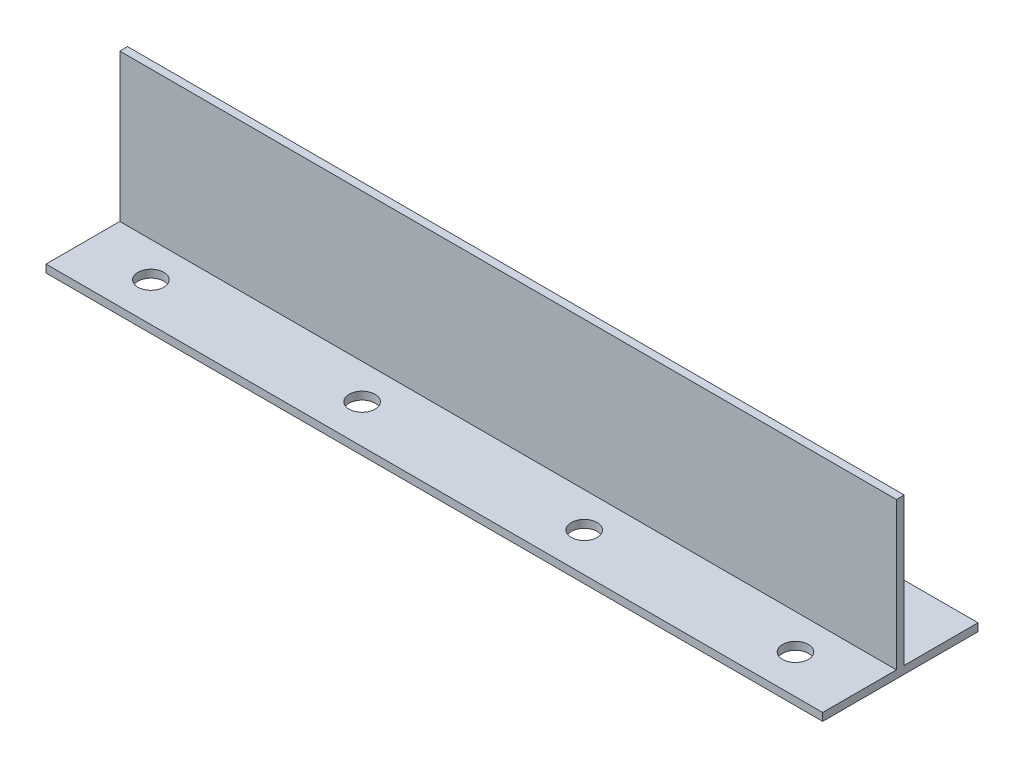
ISO-10303-21;
HEADER;
FILE_DESCRIPTION(('STEP AP214'),'2;1');
FILE_NAME('part.step','',(''),(''),'','','');
FILE_SCHEMA(('AUTOMOTIVE_DESIGN { 1 0 10303 214 1 1 1 1 }'));
ENDSEC;
DATA;
#1=APPLICATION_CONTEXT('core data for automotive mechanical design processes');
#2=APPLICATION_PROTOCOL_DEFINITION('international standard','automotive_design',2000,#1);
#3=PRODUCT_CONTEXT('',#1,'mechanical');
#4=PRODUCT('Part','Part','',(#3));
#5=PRODUCT_RELATED_PRODUCT_CATEGORY('part','',(#4));
#6=PRODUCT_DEFINITION_FORMATION('','',#4);
#7=PRODUCT_DEFINITION_CONTEXT('part definition',#1,'design');
#8=PRODUCT_DEFINITION('design','',#6,#7);
#9=PRODUCT_DEFINITION_SHAPE('','',#8);
#10=(LENGTH_UNIT() NAMED_UNIT(*) SI_UNIT(.MILLI.,.METRE.));
#11=(NAMED_UNIT(*) PLANE_ANGLE_UNIT() SI_UNIT($,.RADIAN.));
#12=(NAMED_UNIT(*) SI_UNIT($,.STERADIAN.) SOLID_ANGLE_UNIT());
#13=UNCERTAINTY_MEASURE_WITH_UNIT(LENGTH_MEASURE(1.E-05),#10,'distance_accuracy_value','');
#14=(GEOMETRIC_REPRESENTATION_CONTEXT(3) GLOBAL_UNCERTAINTY_ASSIGNED_CONTEXT((#13)) GLOBAL_UNIT_ASSIGNED_CONTEXT((#10,
#11,#12)) REPRESENTATION_CONTEXT('',''));
#15=CARTESIAN_POINT('',(0.,0.,0.));
#16=DIRECTION('',(0.,0.,1.));
#17=DIRECTION('',(1.,0.,0.));
#18=AXIS2_PLACEMENT_3D('',#15,#16,#17);
#19=CARTESIAN_POINT('',(150.,1.5,14.25));
#20=DIRECTION('',(0.,0.,-1.));
#21=DIRECTION('',(-1.,0.,0.));
#22=AXIS2_PLACEMENT_3D('',#19,#20,#21);
#23=PLANE('',#22);
#24=DIRECTION('',(0.,-1.,0.));
#25=VECTOR('',#24,1.);
#26=CARTESIAN_POINT('',(0.,1.5,14.25));
#27=LINE('',#26,#25);
#28=CARTESIAN_POINT('',(0.,1.5,14.25));
#29=VERTEX_POINT('',#28);
#30=CARTESIAN_POINT('',(0.,0.,14.25));
#31=VERTEX_POINT('',#30);
#32=EDGE_CURVE('E133',#29,#31,#27,.T.);
#33=ORIENTED_EDGE('',*,*,#32,.T.);
#34=DIRECTION('',(-1.,0.,0.));
#35=VECTOR('',#34,1.);
#36=CARTESIAN_POINT('',(150.,0.,14.25));
#37=LINE('',#36,#35);
#38=CARTESIAN_POINT('',(150.,0.,14.25));
#39=VERTEX_POINT('',#38);
#40=EDGE_CURVE('E11',#39,#31,#37,.T.);
#41=ORIENTED_EDGE('',*,*,#40,.F.);
#42=DIRECTION('',(0.,-1.,0.));
#43=VECTOR('',#42,1.);
#44=CARTESIAN_POINT('',(150.,1.5,14.25));
#45=LINE('',#44,#43);
#46=CARTESIAN_POINT('',(150.,1.5,14.25));
#47=VERTEX_POINT('',#46);
#48=EDGE_CURVE('E148',#47,#39,#45,.T.);
#49=ORIENTED_EDGE('',*,*,#48,.F.);
#50=DIRECTION('',(-1.,0.,0.));
#51=VECTOR('',#50,1.);
#52=CARTESIAN_POINT('',(150.,1.5,14.25));
#53=LINE('',#52,#51);
#54=EDGE_CURVE('E129',#47,#29,#53,.T.);
#55=ORIENTED_EDGE('',*,*,#54,.T.);
#56=EDGE_LOOP('',(#33,#41,#49,#55));
#57=FACE_BOUND('',#56,.T.);
#58=ADVANCED_FACE('F37',(#57),#23,.F.);
#59=CARTESIAN_POINT('',(150.,0.,14.25));
#60=DIRECTION('',(0.,1.,0.));
#61=DIRECTION('',(0.,0.,1.));
#62=AXIS2_PLACEMENT_3D('',#59,#60,#61);
#63=PLANE('',#62);
#64=CARTESIAN_POINT('',(12.75,0.,-8.25));
#65=DIRECTION('',(0.,1.,0.));
#66=DIRECTION('',(0.,0.,1.));
#67=AXIS2_PLACEMENT_3D('',#64,#65,#66);
#68=CIRCLE('',#67,2.5);
#69=CARTESIAN_POINT('',(12.75,0.,-5.75));
#70=VERTEX_POINT('',#69);
#71=EDGE_CURVE('E184',#70,#70,#68,.T.);
#72=ORIENTED_EDGE('',*,*,#71,.T.);
#73=EDGE_LOOP('',(#72));
#74=FACE_BOUND('',#73,.T.);
#75=CARTESIAN_POINT('',(53.55,0.,-8.25));
#76=DIRECTION('',(0.,1.,0.));
#77=DIRECTION('',(0.,0.,1.));
#78=AXIS2_PLACEMENT_3D('',#75,#76,#77);
#79=CIRCLE('',#78,2.49999999999999);
#80=CARTESIAN_POINT('',(53.55,0.,-5.75000000000001));
#81=VERTEX_POINT('',#80);
#82=EDGE_CURVE('E203',#81,#81,#79,.T.);
#83=ORIENTED_EDGE('',*,*,#82,.T.);
#84=EDGE_LOOP('',(#83));
#85=FACE_BOUND('',#84,.T.);
#86=CARTESIAN_POINT('',(53.55,0.,6.75));
#87=DIRECTION('',(0.,1.,0.));
#88=DIRECTION('',(0.,0.,1.));
#89=AXIS2_PLACEMENT_3D('',#86,#87,#88);
#90=CIRCLE('',#89,2.49999999999999);
#91=CARTESIAN_POINT('',(53.55,0.,9.25));
#92=VERTEX_POINT('',#91);
#93=EDGE_CURVE('E197',#92,#92,#90,.T.);
#94=ORIENTED_EDGE('',*,*,#93,.T.);
#95=EDGE_LOOP('',(#94));
#96=FACE_BOUND('',#95,.T.);
#97=CARTESIAN_POINT('',(96.45,0.,6.75));
#98=DIRECTION('',(0.,1.,0.));
#99=DIRECTION('',(0.,0.,-1.));
#100=AXIS2_PLACEMENT_3D('',#97,#98,#99);
#101=CIRCLE('',#100,2.50000000000001);
#102=CARTESIAN_POINT('',(96.45,0.,4.24999999999999));
#103=VERTEX_POINT('',#102);
#104=EDGE_CURVE('E190',#103,#103,#101,.T.);
#105=ORIENTED_EDGE('',*,*,#104,.T.);
#106=EDGE_LOOP('',(#105));
#107=FACE_BOUND('',#106,.T.);
#108=CARTESIAN_POINT('',(96.45,0.,-8.25000000000001));
#109=DIRECTION('',(0.,1.,0.));
#110=DIRECTION('',(0.,0.,-1.));
#111=AXIS2_PLACEMENT_3D('',#108,#109,#110);
#112=CIRCLE('',#111,2.50000000000001);
#113=CARTESIAN_POINT('',(96.45,0.,-10.75));
#114=VERTEX_POINT('',#113);
#115=EDGE_CURVE('E191',#114,#114,#112,.T.);
#116=ORIENTED_EDGE('',*,*,#115,.T.);
#117=EDGE_LOOP('',(#116));
#118=FACE_BOUND('',#117,.T.);
#119=CARTESIAN_POINT('',(137.25,0.,-8.24999999999998));
#120=DIRECTION('',(0.,1.,0.));
#121=DIRECTION('',(0.,0.,-1.));
#122=AXIS2_PLACEMENT_3D('',#119,#120,#121);
#123=CIRCLE('',#122,2.50000000000002);
#124=CARTESIAN_POINT('',(137.25,0.,-10.75));
#125=VERTEX_POINT('',#124);
#126=EDGE_CURVE('E220',#125,#125,#123,.T.);
#127=ORIENTED_EDGE('',*,*,#126,.T.);
#128=EDGE_LOOP('',(#127));
#129=FACE_BOUND('',#128,.T.);
#130=CARTESIAN_POINT('',(137.25,0.,6.74999999999998));
#131=DIRECTION('',(0.,1.,0.));
#132=DIRECTION('',(0.,0.,-1.));
#133=AXIS2_PLACEMENT_3D('',#130,#131,#132);
#134=CIRCLE('',#133,2.50000000000002);
#135=CARTESIAN_POINT('',(137.25,0.,4.24999999999996));
#136=VERTEX_POINT('',#135);
#137=EDGE_CURVE('E214',#136,#136,#134,.T.);
#138=ORIENTED_EDGE('',*,*,#137,.T.);
#139=EDGE_LOOP('',(#138));
#140=FACE_BOUND('',#139,.T.);
#141=CARTESIAN_POINT('',(12.75,0.,6.75));
#142=DIRECTION('',(0.,1.,0.));
#143=DIRECTION('',(0.,0.,1.));
#144=AXIS2_PLACEMENT_3D('',#141,#142,#143);
#145=CIRCLE('',#144,2.5);
#146=CARTESIAN_POINT('',(12.75,0.,9.25));
#147=VERTEX_POINT('',#146);
#148=EDGE_CURVE('E137',#147,#147,#145,.T.);
#149=ORIENTED_EDGE('',*,*,#148,.T.);
#150=EDGE_LOOP('',(#149));
#151=FACE_BOUND('',#150,.T.);
#152=DIRECTION('',(0.,0.,-1.));
#153=VECTOR('',#152,1.);
#154=CARTESIAN_POINT('',(0.,0.,14.25));
#155=LINE('',#154,#153);
#156=CARTESIAN_POINT('',(0.,0.,-15.75));
#157=VERTEX_POINT('',#156);
#158=EDGE_CURVE('E136',#31,#157,#155,.T.);
#159=ORIENTED_EDGE('',*,*,#158,.T.);
#160=DIRECTION('',(-1.,0.,0.));
#161=VECTOR('',#160,1.);
#162=CARTESIAN_POINT('',(150.,0.,-15.75));
#163=LINE('',#162,#161);
#164=CARTESIAN_POINT('',(150.,0.,-15.75));
#165=VERTEX_POINT('',#164);
#166=EDGE_CURVE('E45',#165,#157,#163,.T.);
#167=ORIENTED_EDGE('',*,*,#166,.F.);
#168=DIRECTION('',(0.,0.,-1.));
#169=VECTOR('',#168,1.);
#170=CARTESIAN_POINT('',(150.,0.,14.25));
#171=LINE('',#170,#169);
#172=EDGE_CURVE('E96',#39,#165,#171,.T.);
#173=ORIENTED_EDGE('',*,*,#172,.F.);
#174=ORIENTED_EDGE('',*,*,#40,.T.);
#175=EDGE_LOOP('',(#159,#167,#173,#174));
#176=FACE_BOUND('',#175,.T.);
#177=ADVANCED_FACE('F229',(#74,#85,#96,#107,#118,#129,#140,#151,#176),#63,.F.);
#178=CARTESIAN_POINT('',(150.,0.,-15.75));
#179=DIRECTION('',(0.,0.,1.));
#180=DIRECTION('',(1.,0.,0.));
#181=AXIS2_PLACEMENT_3D('',#178,#179,#180);
#182=PLANE('',#181);
#183=DIRECTION('',(0.,1.,0.));
#184=VECTOR('',#183,1.);
#185=CARTESIAN_POINT('',(0.,0.,-15.75));
#186=LINE('',#185,#184);
#187=CARTESIAN_POINT('',(0.,1.5,-15.75));
#188=VERTEX_POINT('',#187);
#189=EDGE_CURVE('E139',#157,#188,#186,.T.);
#190=ORIENTED_EDGE('',*,*,#189,.T.);
#191=DIRECTION('',(-1.,0.,0.));
#192=VECTOR('',#191,1.);
#193=CARTESIAN_POINT('',(150.,1.5,-15.75));
#194=LINE('',#193,#192);
#195=CARTESIAN_POINT('',(150.,1.5,-15.75));
#196=VERTEX_POINT('',#195);
#197=EDGE_CURVE('E155',#196,#188,#194,.T.);
#198=ORIENTED_EDGE('',*,*,#197,.F.);
#199=DIRECTION('',(0.,1.,0.));
#200=VECTOR('',#199,1.);
#201=CARTESIAN_POINT('',(150.,0.,-15.75));
#202=LINE('',#201,#200);
#203=EDGE_CURVE('E163',#165,#196,#202,.T.);
#204=ORIENTED_EDGE('',*,*,#203,.F.);
#205=ORIENTED_EDGE('',*,*,#166,.T.);
#206=EDGE_LOOP('',(#190,#198,#204,#205));
#207=FACE_BOUND('',#206,.T.);
#208=ADVANCED_FACE('F161',(#207),#182,.F.);
#209=CARTESIAN_POINT('',(150.,1.5,-15.75));
#210=DIRECTION('',(0.,-1.,0.));
#211=DIRECTION('',(0.,0.,-1.));
#212=AXIS2_PLACEMENT_3D('',#209,#210,#211);
#213=PLANE('',#212);
#214=CARTESIAN_POINT('',(12.75,1.5,-8.25));
#215=DIRECTION('',(0.,1.,0.));
#216=DIRECTION('',(0.,0.,1.));
#217=AXIS2_PLACEMENT_3D('',#214,#215,#216);
#218=CIRCLE('',#217,2.5);
#219=CARTESIAN_POINT('',(12.75,1.5,-5.75));
#220=VERTEX_POINT('',#219);
#221=EDGE_CURVE('E206',#220,#220,#218,.T.);
#222=ORIENTED_EDGE('',*,*,#221,.F.);
#223=EDGE_LOOP('',(#222));
#224=FACE_BOUND('',#223,.T.);
#225=CARTESIAN_POINT('',(53.55,1.5,-8.25));
#226=DIRECTION('',(0.,1.,0.));
#227=DIRECTION('',(0.,0.,1.));
#228=AXIS2_PLACEMENT_3D('',#225,#226,#227);
#229=CIRCLE('',#228,2.49999999999999);
#230=CARTESIAN_POINT('',(53.55,1.5,-5.75000000000001));
#231=VERTEX_POINT('',#230);
#232=EDGE_CURVE('E200',#231,#231,#229,.T.);
#233=ORIENTED_EDGE('',*,*,#232,.F.);
#234=EDGE_LOOP('',(#233));
#235=FACE_BOUND('',#234,.T.);
#236=CARTESIAN_POINT('',(96.45,1.5,-8.25000000000001));
#237=DIRECTION('',(0.,1.,0.));
#238=DIRECTION('',(0.,0.,-1.));
#239=AXIS2_PLACEMENT_3D('',#236,#237,#238);
#240=CIRCLE('',#239,2.50000000000001);
#241=CARTESIAN_POINT('',(96.45,1.5,-10.75));
#242=VERTEX_POINT('',#241);
#243=EDGE_CURVE('E223',#242,#242,#240,.T.);
#244=ORIENTED_EDGE('',*,*,#243,.F.);
#245=EDGE_LOOP('',(#244));
#246=FACE_BOUND('',#245,.T.);
#247=CARTESIAN_POINT('',(137.25,1.5,-8.24999999999998));
#248=DIRECTION('',(0.,1.,0.));
#249=DIRECTION('',(0.,0.,-1.));
#250=AXIS2_PLACEMENT_3D('',#247,#248,#249);
#251=CIRCLE('',#250,2.50000000000002);
#252=CARTESIAN_POINT('',(137.25,1.5,-10.75));
#253=VERTEX_POINT('',#252);
#254=EDGE_CURVE('E217',#253,#253,#251,.T.);
#255=ORIENTED_EDGE('',*,*,#254,.F.);
#256=EDGE_LOOP('',(#255));
#257=FACE_BOUND('',#256,.T.);
#258=DIRECTION('',(0.,0.,1.));
#259=VECTOR('',#258,1.);
#260=CARTESIAN_POINT('',(0.,1.5,-15.75));
#261=LINE('',#260,#259);
#262=CARTESIAN_POINT('',(0.,1.5,-1.5));
#263=VERTEX_POINT('',#262);
#264=EDGE_CURVE('E141',#188,#263,#261,.T.);
#265=ORIENTED_EDGE('',*,*,#264,.T.);
#266=DIRECTION('',(-1.,0.,0.));
#267=VECTOR('',#266,1.);
#268=CARTESIAN_POINT('',(150.,1.5,-1.5));
#269=LINE('',#268,#267);
#270=CARTESIAN_POINT('',(150.,1.5,-1.5));
#271=VERTEX_POINT('',#270);
#272=EDGE_CURVE('E152',#271,#263,#269,.T.);
#273=ORIENTED_EDGE('',*,*,#272,.F.);
#274=DIRECTION('',(0.,0.,1.));
#275=VECTOR('',#274,1.);
#276=CARTESIAN_POINT('',(150.,1.5,-15.75));
#277=LINE('',#276,#275);
#278=EDGE_CURVE('E175',#196,#271,#277,.T.);
#279=ORIENTED_EDGE('',*,*,#278,.F.);
#280=ORIENTED_EDGE('',*,*,#197,.T.);
#281=EDGE_LOOP('',(#265,#273,#279,#280));
#282=FACE_BOUND('',#281,.T.);
#283=ADVANCED_FACE('F171',(#224,#235,#246,#257,#282),#213,.F.);
#284=CARTESIAN_POINT('',(150.,1.5,-1.5));
#285=DIRECTION('',(0.,0.,1.));
#286=DIRECTION('',(1.,0.,0.));
#287=AXIS2_PLACEMENT_3D('',#284,#285,#286);
#288=PLANE('',#287);
#289=DIRECTION('',(0.,1.,0.));
#290=VECTOR('',#289,1.);
#291=CARTESIAN_POINT('',(0.,1.5,-1.5));
#292=LINE('',#291,#290);
#293=CARTESIAN_POINT('',(0.,30.,-1.5));
#294=VERTEX_POINT('',#293);
#295=EDGE_CURVE('E143',#263,#294,#292,.T.);
#296=ORIENTED_EDGE('',*,*,#295,.T.);
#297=DIRECTION('',(-1.,0.,0.));
#298=VECTOR('',#297,1.);
#299=CARTESIAN_POINT('',(150.,30.,-1.5));
#300=LINE('',#299,#298);
#301=CARTESIAN_POINT('',(150.,30.,-1.5));
#302=VERTEX_POINT('',#301);
#303=EDGE_CURVE('E124',#302,#294,#300,.T.);
#304=ORIENTED_EDGE('',*,*,#303,.F.);
#305=DIRECTION('',(0.,1.,0.));
#306=VECTOR('',#305,1.);
#307=CARTESIAN_POINT('',(150.,1.5,-1.5));
#308=LINE('',#307,#306);
#309=EDGE_CURVE('E115',#271,#302,#308,.T.);
#310=ORIENTED_EDGE('',*,*,#309,.F.);
#311=ORIENTED_EDGE('',*,*,#272,.T.);
#312=EDGE_LOOP('',(#296,#304,#310,#311));
#313=FACE_BOUND('',#312,.T.);
#314=ADVANCED_FACE('F174',(#313),#288,.F.);
#315=CARTESIAN_POINT('',(150.,30.,-1.5));
#316=DIRECTION('',(0.,-1.,0.));
#317=DIRECTION('',(0.,0.,-1.));
#318=AXIS2_PLACEMENT_3D('',#315,#316,#317);
#319=PLANE('',#318);
#320=DIRECTION('',(0.,0.,1.));
#321=VECTOR('',#320,1.);
#322=CARTESIAN_POINT('',(0.,30.,-1.5));
#323=LINE('',#322,#321);
#324=CARTESIAN_POINT('',(0.,30.,0.));
#325=VERTEX_POINT('',#324);
#326=EDGE_CURVE('E123',#294,#325,#323,.T.);
#327=ORIENTED_EDGE('',*,*,#326,.T.);
#328=DIRECTION('',(-1.,0.,0.));
#329=VECTOR('',#328,1.);
#330=CARTESIAN_POINT('',(150.,30.,0.));
#331=LINE('',#330,#329);
#332=CARTESIAN_POINT('',(150.,30.,0.));
#333=VERTEX_POINT('',#332);
#334=EDGE_CURVE('E120',#333,#325,#331,.T.);
#335=ORIENTED_EDGE('',*,*,#334,.F.);
#336=DIRECTION('',(0.,0.,1.));
#337=VECTOR('',#336,1.);
#338=CARTESIAN_POINT('',(150.,30.,-1.5));
#339=LINE('',#338,#337);
#340=EDGE_CURVE('E109',#302,#333,#339,.T.);
#341=ORIENTED_EDGE('',*,*,#340,.F.);
#342=ORIENTED_EDGE('',*,*,#303,.T.);
#343=EDGE_LOOP('',(#327,#335,#341,#342));
#344=FACE_BOUND('',#343,.T.);
#345=ADVANCED_FACE('F121',(#344),#319,.F.);
#346=CARTESIAN_POINT('',(150.,30.,0.));
#347=DIRECTION('',(0.,0.,-1.));
#348=DIRECTION('',(-1.,0.,0.));
#349=AXIS2_PLACEMENT_3D('',#346,#347,#348);
#350=PLANE('',#349);
#351=DIRECTION('',(0.,-1.,0.));
#352=VECTOR('',#351,1.);
#353=CARTESIAN_POINT('',(0.,30.,0.));
#354=LINE('',#353,#352);
#355=CARTESIAN_POINT('',(0.,1.5,0.));
#356=VERTEX_POINT('',#355);
#357=EDGE_CURVE('E82',#325,#356,#354,.T.);
#358=ORIENTED_EDGE('',*,*,#357,.T.);
#359=DIRECTION('',(-1.,0.,0.));
#360=VECTOR('',#359,1.);
#361=CARTESIAN_POINT('',(150.,1.5,0.));
#362=LINE('',#361,#360);
#363=CARTESIAN_POINT('',(150.,1.5,0.));
#364=VERTEX_POINT('',#363);
#365=EDGE_CURVE('E125',#364,#356,#362,.T.);
#366=ORIENTED_EDGE('',*,*,#365,.F.);
#367=DIRECTION('',(0.,-1.,0.));
#368=VECTOR('',#367,1.);
#369=CARTESIAN_POINT('',(150.,30.,0.));
#370=LINE('',#369,#368);
#371=EDGE_CURVE('E113',#333,#364,#370,.T.);
#372=ORIENTED_EDGE('',*,*,#371,.F.);
#373=ORIENTED_EDGE('',*,*,#334,.T.);
#374=EDGE_LOOP('',(#358,#366,#372,#373));
#375=FACE_BOUND('',#374,.T.);
#376=ADVANCED_FACE('F127',(#375),#350,.F.);
#377=CARTESIAN_POINT('',(150.,1.5,0.));
#378=DIRECTION('',(0.,-1.,0.));
#379=DIRECTION('',(0.,0.,-1.));
#380=AXIS2_PLACEMENT_3D('',#377,#378,#379);
#381=PLANE('',#380);
#382=CARTESIAN_POINT('',(53.55,1.5,6.75));
#383=DIRECTION('',(0.,1.,0.));
#384=DIRECTION('',(0.,0.,1.));
#385=AXIS2_PLACEMENT_3D('',#382,#383,#384);
#386=CIRCLE('',#385,2.49999999999999);
#387=CARTESIAN_POINT('',(53.55,1.5,9.25));
#388=VERTEX_POINT('',#387);
#389=EDGE_CURVE('E194',#388,#388,#386,.T.);
#390=ORIENTED_EDGE('',*,*,#389,.F.);
#391=EDGE_LOOP('',(#390));
#392=FACE_BOUND('',#391,.T.);
#393=CARTESIAN_POINT('',(96.45,1.5,6.75));
#394=DIRECTION('',(0.,1.,0.));
#395=DIRECTION('',(0.,0.,-1.));
#396=AXIS2_PLACEMENT_3D('',#393,#394,#395);
#397=CIRCLE('',#396,2.50000000000001);
#398=CARTESIAN_POINT('',(96.45,1.5,4.24999999999999));
#399=VERTEX_POINT('',#398);
#400=EDGE_CURVE('E187',#399,#399,#397,.T.);
#401=ORIENTED_EDGE('',*,*,#400,.F.);
#402=EDGE_LOOP('',(#401));
#403=FACE_BOUND('',#402,.T.);
#404=CARTESIAN_POINT('',(137.25,1.5,6.74999999999998));
#405=DIRECTION('',(0.,1.,0.));
#406=DIRECTION('',(0.,0.,-1.));
#407=AXIS2_PLACEMENT_3D('',#404,#405,#406);
#408=CIRCLE('',#407,2.50000000000002);
#409=CARTESIAN_POINT('',(137.25,1.5,4.24999999999996));
#410=VERTEX_POINT('',#409);
#411=EDGE_CURVE('E211',#410,#410,#408,.T.);
#412=ORIENTED_EDGE('',*,*,#411,.F.);
#413=EDGE_LOOP('',(#412));
#414=FACE_BOUND('',#413,.T.);
#415=CARTESIAN_POINT('',(12.75,1.5,6.75));
#416=DIRECTION('',(0.,1.,0.));
#417=DIRECTION('',(0.,0.,1.));
#418=AXIS2_PLACEMENT_3D('',#415,#416,#417);
#419=CIRCLE('',#418,2.5);
#420=CARTESIAN_POINT('',(12.75,1.5,9.25));
#421=VERTEX_POINT('',#420);
#422=EDGE_CURVE('E181',#421,#421,#419,.T.);
#423=ORIENTED_EDGE('',*,*,#422,.F.);
#424=EDGE_LOOP('',(#423));
#425=FACE_BOUND('',#424,.T.);
#426=DIRECTION('',(0.,0.,1.));
#427=VECTOR('',#426,1.);
#428=CARTESIAN_POINT('',(0.,1.5,0.));
#429=LINE('',#428,#427);
#430=EDGE_CURVE('E88',#356,#29,#429,.T.);
#431=ORIENTED_EDGE('',*,*,#430,.T.);
#432=ORIENTED_EDGE('',*,*,#54,.F.);
#433=DIRECTION('',(0.,0.,1.));
#434=VECTOR('',#433,1.);
#435=CARTESIAN_POINT('',(150.,1.5,0.));
#436=LINE('',#435,#434);
#437=EDGE_CURVE('E53',#364,#47,#436,.T.);
#438=ORIENTED_EDGE('',*,*,#437,.F.);
#439=ORIENTED_EDGE('',*,*,#365,.T.);
#440=EDGE_LOOP('',(#431,#432,#438,#439));
#441=FACE_BOUND('',#440,.T.);
#442=ADVANCED_FACE('F266',(#392,#403,#414,#425,#441),#381,.F.);
#443=CARTESIAN_POINT('',(150.,0.,0.));
#444=DIRECTION('',(1.,0.,0.));
#445=DIRECTION('',(0.,0.,-1.));
#446=AXIS2_PLACEMENT_3D('',#443,#444,#445);
#447=PLANE('',#446);
#448=ORIENTED_EDGE('',*,*,#48,.T.);
#449=ORIENTED_EDGE('',*,*,#172,.T.);
#450=ORIENTED_EDGE('',*,*,#203,.T.);
#451=ORIENTED_EDGE('',*,*,#278,.T.);
#452=ORIENTED_EDGE('',*,*,#309,.T.);
#453=ORIENTED_EDGE('',*,*,#340,.T.);
#454=ORIENTED_EDGE('',*,*,#371,.T.);
#455=ORIENTED_EDGE('',*,*,#437,.T.);
#456=EDGE_LOOP('',(#448,#449,#450,#451,#452,#453,#454,#455));
#457=FACE_BOUND('',#456,.T.);
#458=ADVANCED_FACE('F111',(#457),#447,.T.);
#459=CARTESIAN_POINT('',(0.,0.,0.));
#460=DIRECTION('',(1.,0.,0.));
#461=DIRECTION('',(0.,0.,-1.));
#462=AXIS2_PLACEMENT_3D('',#459,#460,#461);
#463=PLANE('',#462);
#464=ORIENTED_EDGE('',*,*,#32,.F.);
#465=ORIENTED_EDGE('',*,*,#430,.F.);
#466=ORIENTED_EDGE('',*,*,#357,.F.);
#467=ORIENTED_EDGE('',*,*,#326,.F.);
#468=ORIENTED_EDGE('',*,*,#295,.F.);
#469=ORIENTED_EDGE('',*,*,#264,.F.);
#470=ORIENTED_EDGE('',*,*,#189,.F.);
#471=ORIENTED_EDGE('',*,*,#158,.F.);
#472=EDGE_LOOP('',(#464,#465,#466,#467,#468,#469,#470,#471));
#473=FACE_BOUND('',#472,.T.);
#474=ADVANCED_FACE('F167',(#473),#463,.F.);
#475=CARTESIAN_POINT('',(12.75,0.,6.75));
#476=DIRECTION('',(0.,1.,0.));
#477=DIRECTION('',(0.,0.,1.));
#478=AXIS2_PLACEMENT_3D('',#475,#476,#477);
#479=CYLINDRICAL_SURFACE('',#478,2.5);
#480=ORIENTED_EDGE('',*,*,#148,.F.);
#481=EDGE_LOOP('',(#480));
#482=FACE_BOUND('',#481,.T.);
#483=ORIENTED_EDGE('',*,*,#422,.T.);
#484=EDGE_LOOP('',(#483));
#485=FACE_BOUND('',#484,.T.);
#486=ADVANCED_FACE('F320',(#482,#485),#479,.F.);
#487=CARTESIAN_POINT('',(137.25,0.,6.74999999999998));
#488=DIRECTION('',(0.,1.,0.));
#489=DIRECTION('',(0.,0.,1.));
#490=AXIS2_PLACEMENT_3D('',#487,#488,#489);
#491=CYLINDRICAL_SURFACE('',#490,2.50000000000002);
#492=ORIENTED_EDGE('',*,*,#137,.F.);
#493=EDGE_LOOP('',(#492));
#494=FACE_BOUND('',#493,.T.);
#495=ORIENTED_EDGE('',*,*,#411,.T.);
#496=EDGE_LOOP('',(#495));
#497=FACE_BOUND('',#496,.T.);
#498=ADVANCED_FACE('F345',(#494,#497),#491,.F.);
#499=CARTESIAN_POINT('',(96.45,0.,6.75));
#500=DIRECTION('',(0.,1.,0.));
#501=DIRECTION('',(0.,0.,1.));
#502=AXIS2_PLACEMENT_3D('',#499,#500,#501);
#503=CYLINDRICAL_SURFACE('',#502,2.50000000000001);
#504=ORIENTED_EDGE('',*,*,#104,.F.);
#505=EDGE_LOOP('',(#504));
#506=FACE_BOUND('',#505,.T.);
#507=ORIENTED_EDGE('',*,*,#400,.T.);
#508=EDGE_LOOP('',(#507));
#509=FACE_BOUND('',#508,.T.);
#510=ADVANCED_FACE('F253',(#506,#509),#503,.F.);
#511=CARTESIAN_POINT('',(53.55,0.,6.75));
#512=DIRECTION('',(0.,1.,0.));
#513=DIRECTION('',(0.,0.,1.));
#514=AXIS2_PLACEMENT_3D('',#511,#512,#513);
#515=CYLINDRICAL_SURFACE('',#514,2.49999999999999);
#516=ORIENTED_EDGE('',*,*,#93,.F.);
#517=EDGE_LOOP('',(#516));
#518=FACE_BOUND('',#517,.T.);
#519=ORIENTED_EDGE('',*,*,#389,.T.);
#520=EDGE_LOOP('',(#519));
#521=FACE_BOUND('',#520,.T.);
#522=ADVANCED_FACE('F247',(#518,#521),#515,.F.);
#523=CARTESIAN_POINT('',(137.25,0.,-8.24999999999998));
#524=DIRECTION('',(0.,1.,0.));
#525=DIRECTION('',(0.,0.,1.));
#526=AXIS2_PLACEMENT_3D('',#523,#524,#525);
#527=CYLINDRICAL_SURFACE('',#526,2.50000000000002);
#528=ORIENTED_EDGE('',*,*,#126,.F.);
#529=EDGE_LOOP('',(#528));
#530=FACE_BOUND('',#529,.T.);
#531=ORIENTED_EDGE('',*,*,#254,.T.);
#532=EDGE_LOOP('',(#531));
#533=FACE_BOUND('',#532,.T.);
#534=ADVANCED_FACE('F236',(#530,#533),#527,.F.);
#535=CARTESIAN_POINT('',(96.45,0.,-8.25000000000001));
#536=DIRECTION('',(0.,1.,0.));
#537=DIRECTION('',(0.,0.,1.));
#538=AXIS2_PLACEMENT_3D('',#535,#536,#537);
#539=CYLINDRICAL_SURFACE('',#538,2.50000000000001);
#540=ORIENTED_EDGE('',*,*,#115,.F.);
#541=EDGE_LOOP('',(#540));
#542=FACE_BOUND('',#541,.T.);
#543=ORIENTED_EDGE('',*,*,#243,.T.);
#544=EDGE_LOOP('',(#543));
#545=FACE_BOUND('',#544,.T.);
#546=ADVANCED_FACE('F232',(#542,#545),#539,.F.);
#547=CARTESIAN_POINT('',(53.55,0.,-8.25));
#548=DIRECTION('',(0.,1.,0.));
#549=DIRECTION('',(0.,0.,1.));
#550=AXIS2_PLACEMENT_3D('',#547,#548,#549);
#551=CYLINDRICAL_SURFACE('',#550,2.49999999999999);
#552=ORIENTED_EDGE('',*,*,#82,.F.);
#553=EDGE_LOOP('',(#552));
#554=FACE_BOUND('',#553,.T.);
#555=ORIENTED_EDGE('',*,*,#232,.T.);
#556=EDGE_LOOP('',(#555));
#557=FACE_BOUND('',#556,.T.);
#558=ADVANCED_FACE('F235',(#554,#557),#551,.F.);
#559=CARTESIAN_POINT('',(12.75,0.,-8.25));
#560=DIRECTION('',(0.,1.,0.));
#561=DIRECTION('',(0.,0.,1.));
#562=AXIS2_PLACEMENT_3D('',#559,#560,#561);
#563=CYLINDRICAL_SURFACE('',#562,2.5);
#564=ORIENTED_EDGE('',*,*,#71,.F.);
#565=EDGE_LOOP('',(#564));
#566=FACE_BOUND('',#565,.T.);
#567=ORIENTED_EDGE('',*,*,#221,.T.);
#568=EDGE_LOOP('',(#567));
#569=FACE_BOUND('',#568,.T.);
#570=ADVANCED_FACE('F382',(#566,#569),#563,.F.);
#571=CLOSED_SHELL('',(#58,#177,#208,#283,#314,#345,#376,#442,#458,#474,#486,#498,#510,#522,#534,
#546,#558,#570));
#572=MANIFOLD_SOLID_BREP('B2',#571);
#573=ADVANCED_BREP_SHAPE_REPRESENTATION('',(#18,#572),#14);
#574=SHAPE_DEFINITION_REPRESENTATION(#9,#573);
ENDSEC;
END-ISO-10303-21;
